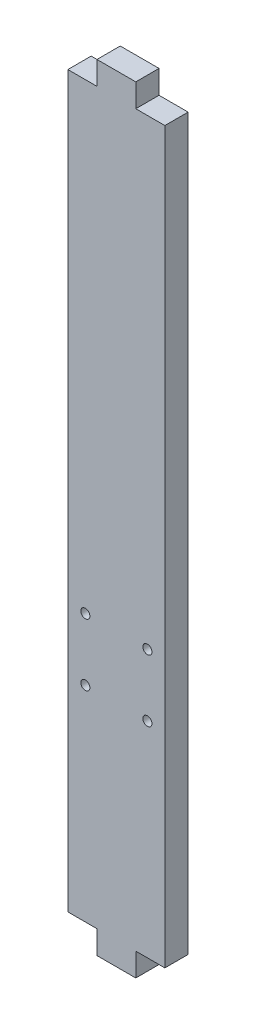
ISO-10303-21;
HEADER;
FILE_DESCRIPTION(('STEP AP214'),'2;1');
FILE_NAME('part.step','',(''),(''),'','','');
FILE_SCHEMA(('AUTOMOTIVE_DESIGN { 1 0 10303 214 1 1 1 1 }'));
ENDSEC;
DATA;
#1=APPLICATION_CONTEXT('core data for automotive mechanical design processes');
#2=APPLICATION_PROTOCOL_DEFINITION('international standard','automotive_design',2000,#1);
#3=PRODUCT_CONTEXT('',#1,'mechanical');
#4=PRODUCT('Part','Part','',(#3));
#5=PRODUCT_RELATED_PRODUCT_CATEGORY('part','',(#4));
#6=PRODUCT_DEFINITION_FORMATION('','',#4);
#7=PRODUCT_DEFINITION_CONTEXT('part definition',#1,'design');
#8=PRODUCT_DEFINITION('design','',#6,#7);
#9=PRODUCT_DEFINITION_SHAPE('','',#8);
#10=(LENGTH_UNIT() NAMED_UNIT(*) SI_UNIT(.MILLI.,.METRE.));
#11=(NAMED_UNIT(*) PLANE_ANGLE_UNIT() SI_UNIT($,.RADIAN.));
#12=(NAMED_UNIT(*) SI_UNIT($,.STERADIAN.) SOLID_ANGLE_UNIT());
#13=UNCERTAINTY_MEASURE_WITH_UNIT(LENGTH_MEASURE(1.E-05),#10,'distance_accuracy_value','');
#14=(GEOMETRIC_REPRESENTATION_CONTEXT(3) GLOBAL_UNCERTAINTY_ASSIGNED_CONTEXT((#13)) GLOBAL_UNIT_ASSIGNED_CONTEXT((#10,
#11,#12)) REPRESENTATION_CONTEXT('',''));
#15=CARTESIAN_POINT('',(0.,0.,0.));
#16=DIRECTION('',(0.,0.,1.));
#17=DIRECTION('',(1.,0.,0.));
#18=AXIS2_PLACEMENT_3D('',#15,#16,#17);
#19=CARTESIAN_POINT('',(-12.5,100.,6.));
#20=DIRECTION('',(1.,0.,0.));
#21=DIRECTION('',(0.,1.,0.));
#22=AXIS2_PLACEMENT_3D('',#19,#20,#21);
#23=PLANE('',#22);
#24=DIRECTION('',(0.,-1.,0.));
#25=VECTOR('',#24,1.);
#26=CARTESIAN_POINT('',(-12.5,100.,6.));
#27=LINE('',#26,#25);
#28=CARTESIAN_POINT('',(-12.5,94.,6.));
#29=VERTEX_POINT('',#28);
#30=CARTESIAN_POINT('',(-12.5,-94.,6.));
#31=VERTEX_POINT('',#30);
#32=EDGE_CURVE('E138',#29,#31,#27,.T.);
#33=ORIENTED_EDGE('',*,*,#32,.F.);
#34=DIRECTION('',(0.,0.,1.));
#35=VECTOR('',#34,1.);
#36=CARTESIAN_POINT('',(-12.5,94.,0.));
#37=LINE('',#36,#35);
#38=CARTESIAN_POINT('',(-12.5,94.,0.));
#39=VERTEX_POINT('',#38);
#40=EDGE_CURVE('E126',#39,#29,#37,.T.);
#41=ORIENTED_EDGE('',*,*,#40,.F.);
#42=DIRECTION('',(0.,-1.,0.));
#43=VECTOR('',#42,1.);
#44=CARTESIAN_POINT('',(-12.5,100.,0.));
#45=LINE('',#44,#43);
#46=CARTESIAN_POINT('',(-12.5,-94.,0.));
#47=VERTEX_POINT('',#46);
#48=EDGE_CURVE('E136',#39,#47,#45,.T.);
#49=ORIENTED_EDGE('',*,*,#48,.T.);
#50=DIRECTION('',(0.,0.,1.));
#51=VECTOR('',#50,1.);
#52=CARTESIAN_POINT('',(-12.5,-94.,0.));
#53=LINE('',#52,#51);
#54=EDGE_CURVE('E219',#47,#31,#53,.T.);
#55=ORIENTED_EDGE('',*,*,#54,.T.);
#56=EDGE_LOOP('',(#33,#41,#49,#55));
#57=FACE_BOUND('',#56,.T.);
#58=ADVANCED_FACE('F33',(#57),#23,.F.);
#59=CARTESIAN_POINT('',(-12.5,-100.,6.));
#60=DIRECTION('',(0.,1.,0.));
#61=DIRECTION('',(0.,0.,1.));
#62=AXIS2_PLACEMENT_3D('',#59,#60,#61);
#63=PLANE('',#62);
#64=DIRECTION('',(1.,0.,0.));
#65=VECTOR('',#64,1.);
#66=CARTESIAN_POINT('',(-12.5,-100.,0.));
#67=LINE('',#66,#65);
#68=CARTESIAN_POINT('',(-4.99999999999997,-100.,0.));
#69=VERTEX_POINT('',#68);
#70=CARTESIAN_POINT('',(5.00000000000003,-100.,0.));
#71=VERTEX_POINT('',#70);
#72=EDGE_CURVE('E144',#69,#71,#67,.T.);
#73=ORIENTED_EDGE('',*,*,#72,.T.);
#74=DIRECTION('',(0.,0.,1.));
#75=VECTOR('',#74,1.);
#76=CARTESIAN_POINT('',(5.00000000000003,-100.,0.));
#77=LINE('',#76,#75);
#78=CARTESIAN_POINT('',(5.00000000000003,-100.,6.));
#79=VERTEX_POINT('',#78);
#80=EDGE_CURVE('E204',#71,#79,#77,.T.);
#81=ORIENTED_EDGE('',*,*,#80,.T.);
#82=DIRECTION('',(1.,0.,0.));
#83=VECTOR('',#82,1.);
#84=CARTESIAN_POINT('',(-12.5,-100.,6.));
#85=LINE('',#84,#83);
#86=CARTESIAN_POINT('',(-4.99999999999997,-100.,6.));
#87=VERTEX_POINT('',#86);
#88=EDGE_CURVE('E164',#87,#79,#85,.T.);
#89=ORIENTED_EDGE('',*,*,#88,.F.);
#90=DIRECTION('',(0.,0.,1.));
#91=VECTOR('',#90,1.);
#92=CARTESIAN_POINT('',(-4.99999999999997,-100.,0.));
#93=LINE('',#92,#91);
#94=EDGE_CURVE('E215',#69,#87,#93,.T.);
#95=ORIENTED_EDGE('',*,*,#94,.F.);
#96=EDGE_LOOP('',(#73,#81,#89,#95));
#97=FACE_BOUND('',#96,.T.);
#98=ADVANCED_FACE('F267',(#97),#63,.F.);
#99=CARTESIAN_POINT('',(12.5,100.,6.));
#100=DIRECTION('',(-1.,0.,0.));
#101=DIRECTION('',(0.,0.,1.));
#102=AXIS2_PLACEMENT_3D('',#99,#100,#101);
#103=PLANE('',#102);
#104=DIRECTION('',(0.,1.,0.));
#105=VECTOR('',#104,1.);
#106=CARTESIAN_POINT('',(12.5,100.,0.));
#107=LINE('',#106,#105);
#108=CARTESIAN_POINT('',(12.5,-94.,0.));
#109=VERTEX_POINT('',#108);
#110=CARTESIAN_POINT('',(12.5,94.,0.));
#111=VERTEX_POINT('',#110);
#112=EDGE_CURVE('E148',#109,#111,#107,.T.);
#113=ORIENTED_EDGE('',*,*,#112,.T.);
#114=DIRECTION('',(0.,0.,1.));
#115=VECTOR('',#114,1.);
#116=CARTESIAN_POINT('',(12.5,94.,0.));
#117=LINE('',#116,#115);
#118=CARTESIAN_POINT('',(12.5,94.,6.));
#119=VERTEX_POINT('',#118);
#120=EDGE_CURVE('E186',#111,#119,#117,.T.);
#121=ORIENTED_EDGE('',*,*,#120,.T.);
#122=DIRECTION('',(0.,1.,0.));
#123=VECTOR('',#122,1.);
#124=CARTESIAN_POINT('',(12.5,100.,6.));
#125=LINE('',#124,#123);
#126=CARTESIAN_POINT('',(12.5,-94.,6.));
#127=VERTEX_POINT('',#126);
#128=EDGE_CURVE('E41',#127,#119,#125,.T.);
#129=ORIENTED_EDGE('',*,*,#128,.F.);
#130=DIRECTION('',(0.,0.,1.));
#131=VECTOR('',#130,1.);
#132=CARTESIAN_POINT('',(12.5,-94.,0.));
#133=LINE('',#132,#131);
#134=EDGE_CURVE('E185',#109,#127,#133,.T.);
#135=ORIENTED_EDGE('',*,*,#134,.F.);
#136=EDGE_LOOP('',(#113,#121,#129,#135));
#137=FACE_BOUND('',#136,.T.);
#138=ADVANCED_FACE('F184',(#137),#103,.F.);
#139=CARTESIAN_POINT('',(-12.5,100.,6.));
#140=DIRECTION('',(0.,-1.,0.));
#141=DIRECTION('',(0.,0.,-1.));
#142=AXIS2_PLACEMENT_3D('',#139,#140,#141);
#143=PLANE('',#142);
#144=DIRECTION('',(-1.,0.,0.));
#145=VECTOR('',#144,1.);
#146=CARTESIAN_POINT('',(-12.5,100.,0.));
#147=LINE('',#146,#145);
#148=CARTESIAN_POINT('',(5.00000000000003,100.,0.));
#149=VERTEX_POINT('',#148);
#150=CARTESIAN_POINT('',(-4.99999999999997,100.,0.));
#151=VERTEX_POINT('',#150);
#152=EDGE_CURVE('E36',#149,#151,#147,.T.);
#153=ORIENTED_EDGE('',*,*,#152,.T.);
#154=DIRECTION('',(0.,0.,1.));
#155=VECTOR('',#154,1.);
#156=CARTESIAN_POINT('',(-4.99999999999997,100.,0.));
#157=LINE('',#156,#155);
#158=CARTESIAN_POINT('',(-4.99999999999997,100.,6.));
#159=VERTEX_POINT('',#158);
#160=EDGE_CURVE('E426',#151,#159,#157,.T.);
#161=ORIENTED_EDGE('',*,*,#160,.T.);
#162=DIRECTION('',(-1.,0.,0.));
#163=VECTOR('',#162,1.);
#164=CARTESIAN_POINT('',(-12.5,100.,6.));
#165=LINE('',#164,#163);
#166=CARTESIAN_POINT('',(5.00000000000003,100.,6.));
#167=VERTEX_POINT('',#166);
#168=EDGE_CURVE('E11',#167,#159,#165,.T.);
#169=ORIENTED_EDGE('',*,*,#168,.F.);
#170=DIRECTION('',(0.,0.,1.));
#171=VECTOR('',#170,1.);
#172=CARTESIAN_POINT('',(5.00000000000003,100.,0.));
#173=LINE('',#172,#171);
#174=EDGE_CURVE('E191',#149,#167,#173,.T.);
#175=ORIENTED_EDGE('',*,*,#174,.F.);
#176=EDGE_LOOP('',(#153,#161,#169,#175));
#177=FACE_BOUND('',#176,.T.);
#178=ADVANCED_FACE('F247',(#177),#143,.F.);
#179=CARTESIAN_POINT('',(0.,0.,6.));
#180=DIRECTION('',(0.,0.,1.));
#181=DIRECTION('',(1.,0.,0.));
#182=AXIS2_PLACEMENT_3D('',#179,#180,#181);
#183=PLANE('',#182);
#184=DIRECTION('',(0.,1.,0.));
#185=VECTOR('',#184,1.);
#186=CARTESIAN_POINT('',(-4.99999999999997,100.,6.));
#187=LINE('',#186,#185);
#188=CARTESIAN_POINT('',(-4.99999999999997,94.,6.));
#189=VERTEX_POINT('',#188);
#190=EDGE_CURVE('E131',#189,#159,#187,.T.);
#191=ORIENTED_EDGE('',*,*,#190,.F.);
#192=DIRECTION('',(1.,0.,0.));
#193=VECTOR('',#192,1.);
#194=CARTESIAN_POINT('',(-12.5,94.,6.));
#195=LINE('',#194,#193);
#196=EDGE_CURVE('E427',#29,#189,#195,.T.);
#197=ORIENTED_EDGE('',*,*,#196,.F.);
#198=ORIENTED_EDGE('',*,*,#32,.T.);
#199=DIRECTION('',(-1.,0.,0.));
#200=VECTOR('',#199,1.);
#201=CARTESIAN_POINT('',(-12.5,-94.,6.));
#202=LINE('',#201,#200);
#203=CARTESIAN_POINT('',(-4.99999999999997,-94.,6.));
#204=VERTEX_POINT('',#203);
#205=EDGE_CURVE('E213',#204,#31,#202,.T.);
#206=ORIENTED_EDGE('',*,*,#205,.F.);
#207=DIRECTION('',(0.,1.,0.));
#208=VECTOR('',#207,1.);
#209=CARTESIAN_POINT('',(-4.99999999999997,-100.,6.));
#210=LINE('',#209,#208);
#211=EDGE_CURVE('E207',#87,#204,#210,.T.);
#212=ORIENTED_EDGE('',*,*,#211,.F.);
#213=ORIENTED_EDGE('',*,*,#88,.T.);
#214=DIRECTION('',(0.,-1.,0.));
#215=VECTOR('',#214,1.);
#216=CARTESIAN_POINT('',(5.00000000000003,-100.,6.));
#217=LINE('',#216,#215);
#218=CARTESIAN_POINT('',(5.00000000000003,-94.,6.));
#219=VERTEX_POINT('',#218);
#220=EDGE_CURVE('E189',#219,#79,#217,.T.);
#221=ORIENTED_EDGE('',*,*,#220,.F.);
#222=DIRECTION('',(-1.,0.,0.));
#223=VECTOR('',#222,1.);
#224=CARTESIAN_POINT('',(12.5,-94.,6.));
#225=LINE('',#224,#223);
#226=EDGE_CURVE('E183',#127,#219,#225,.T.);
#227=ORIENTED_EDGE('',*,*,#226,.F.);
#228=ORIENTED_EDGE('',*,*,#128,.T.);
#229=DIRECTION('',(1.,0.,0.));
#230=VECTOR('',#229,1.);
#231=CARTESIAN_POINT('',(12.5,94.,6.));
#232=LINE('',#231,#230);
#233=CARTESIAN_POINT('',(5.00000000000003,94.,6.));
#234=VERTEX_POINT('',#233);
#235=EDGE_CURVE('E180',#234,#119,#232,.T.);
#236=ORIENTED_EDGE('',*,*,#235,.F.);
#237=DIRECTION('',(0.,-1.,0.));
#238=VECTOR('',#237,1.);
#239=CARTESIAN_POINT('',(5.00000000000003,100.,6.));
#240=LINE('',#239,#238);
#241=EDGE_CURVE('E430',#167,#234,#240,.T.);
#242=ORIENTED_EDGE('',*,*,#241,.F.);
#243=ORIENTED_EDGE('',*,*,#168,.T.);
#244=EDGE_LOOP('',(#191,#197,#198,#206,#212,#213,#221,#227,#228,#236,#242,#243));
#245=FACE_BOUND('',#244,.T.);
#246=CARTESIAN_POINT('',(8.,-25.15,6.));
#247=DIRECTION('',(0.,0.,1.));
#248=DIRECTION('',(1.,0.,0.));
#249=AXIS2_PLACEMENT_3D('',#246,#247,#248);
#250=CIRCLE('',#249,1.17499999999999);
#251=CARTESIAN_POINT('',(9.17499999999999,-25.15,6.));
#252=VERTEX_POINT('',#251);
#253=EDGE_CURVE('E221',#252,#252,#250,.T.);
#254=ORIENTED_EDGE('',*,*,#253,.F.);
#255=EDGE_LOOP('',(#254));
#256=FACE_BOUND('',#255,.T.);
#257=CARTESIAN_POINT('',(-8.,-25.15,6.));
#258=DIRECTION('',(0.,0.,1.));
#259=DIRECTION('',(1.,0.,0.));
#260=AXIS2_PLACEMENT_3D('',#257,#258,#259);
#261=CIRCLE('',#260,1.17499999999999);
#262=CARTESIAN_POINT('',(-6.825,-25.15,6.));
#263=VERTEX_POINT('',#262);
#264=EDGE_CURVE('E228',#263,#263,#261,.T.);
#265=ORIENTED_EDGE('',*,*,#264,.F.);
#266=EDGE_LOOP('',(#265));
#267=FACE_BOUND('',#266,.T.);
#268=CARTESIAN_POINT('',(-8.,-41.15,6.));
#269=DIRECTION('',(0.,0.,1.));
#270=DIRECTION('',(1.,0.,0.));
#271=AXIS2_PLACEMENT_3D('',#268,#269,#270);
#272=CIRCLE('',#271,1.175);
#273=CARTESIAN_POINT('',(-6.825,-41.15,6.));
#274=VERTEX_POINT('',#273);
#275=EDGE_CURVE('E234',#274,#274,#272,.T.);
#276=ORIENTED_EDGE('',*,*,#275,.F.);
#277=EDGE_LOOP('',(#276));
#278=FACE_BOUND('',#277,.T.);
#279=CARTESIAN_POINT('',(8.,-41.15,6.));
#280=DIRECTION('',(0.,0.,1.));
#281=DIRECTION('',(1.,0.,0.));
#282=AXIS2_PLACEMENT_3D('',#279,#280,#281);
#283=CIRCLE('',#282,1.17499999999999);
#284=CARTESIAN_POINT('',(9.175,-41.15,6.));
#285=VERTEX_POINT('',#284);
#286=EDGE_CURVE('E151',#285,#285,#283,.T.);
#287=ORIENTED_EDGE('',*,*,#286,.F.);
#288=EDGE_LOOP('',(#287));
#289=FACE_BOUND('',#288,.T.);
#290=ADVANCED_FACE('F177',(#245,#256,#267,#278,#289),#183,.T.);
#291=CARTESIAN_POINT('',(0.,0.,0.));
#292=DIRECTION('',(0.,0.,1.));
#293=DIRECTION('',(1.,0.,0.));
#294=AXIS2_PLACEMENT_3D('',#291,#292,#293);
#295=PLANE('',#294);
#296=CARTESIAN_POINT('',(8.,-25.15,0.));
#297=DIRECTION('',(0.,0.,1.));
#298=DIRECTION('',(1.,0.,0.));
#299=AXIS2_PLACEMENT_3D('',#296,#297,#298);
#300=CIRCLE('',#299,1.17499999999999);
#301=CARTESIAN_POINT('',(9.17499999999999,-25.15,0.));
#302=VERTEX_POINT('',#301);
#303=EDGE_CURVE('E225',#302,#302,#300,.T.);
#304=ORIENTED_EDGE('',*,*,#303,.T.);
#305=EDGE_LOOP('',(#304));
#306=FACE_BOUND('',#305,.T.);
#307=CARTESIAN_POINT('',(-8.,-25.15,0.));
#308=DIRECTION('',(0.,0.,1.));
#309=DIRECTION('',(1.,0.,0.));
#310=AXIS2_PLACEMENT_3D('',#307,#308,#309);
#311=CIRCLE('',#310,1.17499999999999);
#312=CARTESIAN_POINT('',(-6.825,-25.15,0.));
#313=VERTEX_POINT('',#312);
#314=EDGE_CURVE('E231',#313,#313,#311,.T.);
#315=ORIENTED_EDGE('',*,*,#314,.T.);
#316=EDGE_LOOP('',(#315));
#317=FACE_BOUND('',#316,.T.);
#318=CARTESIAN_POINT('',(-8.,-41.15,0.));
#319=DIRECTION('',(0.,0.,1.));
#320=DIRECTION('',(1.,0.,0.));
#321=AXIS2_PLACEMENT_3D('',#318,#319,#320);
#322=CIRCLE('',#321,1.175);
#323=CARTESIAN_POINT('',(-6.825,-41.15,0.));
#324=VERTEX_POINT('',#323);
#325=EDGE_CURVE('E237',#324,#324,#322,.T.);
#326=ORIENTED_EDGE('',*,*,#325,.T.);
#327=EDGE_LOOP('',(#326));
#328=FACE_BOUND('',#327,.T.);
#329=CARTESIAN_POINT('',(8.,-41.15,0.));
#330=DIRECTION('',(0.,0.,1.));
#331=DIRECTION('',(1.,0.,0.));
#332=AXIS2_PLACEMENT_3D('',#329,#330,#331);
#333=CIRCLE('',#332,1.17499999999999);
#334=CARTESIAN_POINT('',(9.175,-41.15,0.));
#335=VERTEX_POINT('',#334);
#336=EDGE_CURVE('E145',#335,#335,#333,.T.);
#337=ORIENTED_EDGE('',*,*,#336,.T.);
#338=EDGE_LOOP('',(#337));
#339=FACE_BOUND('',#338,.T.);
#340=DIRECTION('',(1.,0.,0.));
#341=VECTOR('',#340,1.);
#342=CARTESIAN_POINT('',(-12.5,94.,0.));
#343=LINE('',#342,#341);
#344=CARTESIAN_POINT('',(-4.99999999999997,94.,0.));
#345=VERTEX_POINT('',#344);
#346=EDGE_CURVE('E122',#39,#345,#343,.T.);
#347=ORIENTED_EDGE('',*,*,#346,.T.);
#348=DIRECTION('',(0.,1.,0.));
#349=VECTOR('',#348,1.);
#350=CARTESIAN_POINT('',(-4.99999999999997,100.,0.));
#351=LINE('',#350,#349);
#352=EDGE_CURVE('E49',#345,#151,#351,.T.);
#353=ORIENTED_EDGE('',*,*,#352,.T.);
#354=ORIENTED_EDGE('',*,*,#152,.F.);
#355=DIRECTION('',(0.,-1.,0.));
#356=VECTOR('',#355,1.);
#357=CARTESIAN_POINT('',(5.00000000000003,100.,0.));
#358=LINE('',#357,#356);
#359=CARTESIAN_POINT('',(5.00000000000003,94.,0.));
#360=VERTEX_POINT('',#359);
#361=EDGE_CURVE('E433',#149,#360,#358,.T.);
#362=ORIENTED_EDGE('',*,*,#361,.T.);
#363=DIRECTION('',(1.,0.,0.));
#364=VECTOR('',#363,1.);
#365=CARTESIAN_POINT('',(12.5,94.,0.));
#366=LINE('',#365,#364);
#367=EDGE_CURVE('E57',#360,#111,#366,.T.);
#368=ORIENTED_EDGE('',*,*,#367,.T.);
#369=ORIENTED_EDGE('',*,*,#112,.F.);
#370=DIRECTION('',(-1.,0.,0.));
#371=VECTOR('',#370,1.);
#372=CARTESIAN_POINT('',(12.5,-94.,0.));
#373=LINE('',#372,#371);
#374=CARTESIAN_POINT('',(5.00000000000003,-94.,0.));
#375=VERTEX_POINT('',#374);
#376=EDGE_CURVE('E197',#109,#375,#373,.T.);
#377=ORIENTED_EDGE('',*,*,#376,.T.);
#378=DIRECTION('',(0.,-1.,0.));
#379=VECTOR('',#378,1.);
#380=CARTESIAN_POINT('',(5.00000000000003,-100.,0.));
#381=LINE('',#380,#379);
#382=EDGE_CURVE('E200',#375,#71,#381,.T.);
#383=ORIENTED_EDGE('',*,*,#382,.T.);
#384=ORIENTED_EDGE('',*,*,#72,.F.);
#385=DIRECTION('',(0.,1.,0.));
#386=VECTOR('',#385,1.);
#387=CARTESIAN_POINT('',(-4.99999999999997,-100.,0.));
#388=LINE('',#387,#386);
#389=CARTESIAN_POINT('',(-4.99999999999997,-94.,0.));
#390=VERTEX_POINT('',#389);
#391=EDGE_CURVE('E211',#69,#390,#388,.T.);
#392=ORIENTED_EDGE('',*,*,#391,.T.);
#393=DIRECTION('',(-1.,0.,0.));
#394=VECTOR('',#393,1.);
#395=CARTESIAN_POINT('',(-12.5,-94.,0.));
#396=LINE('',#395,#394);
#397=EDGE_CURVE('E143',#390,#47,#396,.T.);
#398=ORIENTED_EDGE('',*,*,#397,.T.);
#399=ORIENTED_EDGE('',*,*,#48,.F.);
#400=EDGE_LOOP('',(#347,#353,#354,#362,#368,#369,#377,#383,#384,#392,#398,#399));
#401=FACE_BOUND('',#400,.T.);
#402=ADVANCED_FACE('F141',(#306,#317,#328,#339,#401),#295,.F.);
#403=CARTESIAN_POINT('',(8.,-41.15,0.));
#404=DIRECTION('',(0.,0.,1.));
#405=DIRECTION('',(1.,0.,0.));
#406=AXIS2_PLACEMENT_3D('',#403,#404,#405);
#407=CYLINDRICAL_SURFACE('',#406,1.17499999999999);
#408=ORIENTED_EDGE('',*,*,#336,.F.);
#409=EDGE_LOOP('',(#408));
#410=FACE_BOUND('',#409,.T.);
#411=ORIENTED_EDGE('',*,*,#286,.T.);
#412=EDGE_LOOP('',(#411));
#413=FACE_BOUND('',#412,.T.);
#414=ADVANCED_FACE('F252',(#410,#413),#407,.F.);
#415=CARTESIAN_POINT('',(-8.,-41.15,0.));
#416=DIRECTION('',(0.,0.,1.));
#417=DIRECTION('',(1.,0.,0.));
#418=AXIS2_PLACEMENT_3D('',#415,#416,#417);
#419=CYLINDRICAL_SURFACE('',#418,1.175);
#420=ORIENTED_EDGE('',*,*,#325,.F.);
#421=EDGE_LOOP('',(#420));
#422=FACE_BOUND('',#421,.T.);
#423=ORIENTED_EDGE('',*,*,#275,.T.);
#424=EDGE_LOOP('',(#423));
#425=FACE_BOUND('',#424,.T.);
#426=ADVANCED_FACE('F243',(#422,#425),#419,.F.);
#427=CARTESIAN_POINT('',(-8.,-25.15,0.));
#428=DIRECTION('',(0.,0.,1.));
#429=DIRECTION('',(1.,0.,0.));
#430=AXIS2_PLACEMENT_3D('',#427,#428,#429);
#431=CYLINDRICAL_SURFACE('',#430,1.17499999999999);
#432=ORIENTED_EDGE('',*,*,#314,.F.);
#433=EDGE_LOOP('',(#432));
#434=FACE_BOUND('',#433,.T.);
#435=ORIENTED_EDGE('',*,*,#264,.T.);
#436=EDGE_LOOP('',(#435));
#437=FACE_BOUND('',#436,.T.);
#438=ADVANCED_FACE('F260',(#434,#437),#431,.F.);
#439=CARTESIAN_POINT('',(8.,-25.15,0.));
#440=DIRECTION('',(0.,0.,1.));
#441=DIRECTION('',(1.,0.,0.));
#442=AXIS2_PLACEMENT_3D('',#439,#440,#441);
#443=CYLINDRICAL_SURFACE('',#442,1.17499999999999);
#444=ORIENTED_EDGE('',*,*,#303,.F.);
#445=EDGE_LOOP('',(#444));
#446=FACE_BOUND('',#445,.T.);
#447=ORIENTED_EDGE('',*,*,#253,.T.);
#448=EDGE_LOOP('',(#447));
#449=FACE_BOUND('',#448,.T.);
#450=ADVANCED_FACE('F302',(#446,#449),#443,.F.);
#451=CARTESIAN_POINT('',(-12.5,-94.,0.));
#452=DIRECTION('',(0.,1.,0.));
#453=DIRECTION('',(0.,0.,1.));
#454=AXIS2_PLACEMENT_3D('',#451,#452,#453);
#455=PLANE('',#454);
#456=ORIENTED_EDGE('',*,*,#205,.T.);
#457=ORIENTED_EDGE('',*,*,#54,.F.);
#458=ORIENTED_EDGE('',*,*,#397,.F.);
#459=DIRECTION('',(0.,0.,1.));
#460=VECTOR('',#459,1.);
#461=CARTESIAN_POINT('',(-4.99999999999997,-94.,0.));
#462=LINE('',#461,#460);
#463=EDGE_CURVE('E222',#390,#204,#462,.T.);
#464=ORIENTED_EDGE('',*,*,#463,.T.);
#465=EDGE_LOOP('',(#456,#457,#458,#464));
#466=FACE_BOUND('',#465,.T.);
#467=ADVANCED_FACE('F296',(#466),#455,.F.);
#468=CARTESIAN_POINT('',(-4.99999999999997,-100.,0.));
#469=DIRECTION('',(1.,0.,0.));
#470=DIRECTION('',(0.,0.,-1.));
#471=AXIS2_PLACEMENT_3D('',#468,#469,#470);
#472=PLANE('',#471);
#473=ORIENTED_EDGE('',*,*,#211,.T.);
#474=ORIENTED_EDGE('',*,*,#463,.F.);
#475=ORIENTED_EDGE('',*,*,#391,.F.);
#476=ORIENTED_EDGE('',*,*,#94,.T.);
#477=EDGE_LOOP('',(#473,#474,#475,#476));
#478=FACE_BOUND('',#477,.T.);
#479=ADVANCED_FACE('F301',(#478),#472,.F.);
#480=CARTESIAN_POINT('',(5.00000000000003,-100.,0.));
#481=DIRECTION('',(-1.,0.,0.));
#482=DIRECTION('',(0.,0.,1.));
#483=AXIS2_PLACEMENT_3D('',#480,#481,#482);
#484=PLANE('',#483);
#485=ORIENTED_EDGE('',*,*,#220,.T.);
#486=ORIENTED_EDGE('',*,*,#80,.F.);
#487=ORIENTED_EDGE('',*,*,#382,.F.);
#488=DIRECTION('',(0.,0.,1.));
#489=VECTOR('',#488,1.);
#490=CARTESIAN_POINT('',(5.00000000000003,-94.,0.));
#491=LINE('',#490,#489);
#492=EDGE_CURVE('E208',#375,#219,#491,.T.);
#493=ORIENTED_EDGE('',*,*,#492,.T.);
#494=EDGE_LOOP('',(#485,#486,#487,#493));
#495=FACE_BOUND('',#494,.T.);
#496=ADVANCED_FACE('F314',(#495),#484,.F.);
#497=CARTESIAN_POINT('',(12.5,-94.,0.));
#498=DIRECTION('',(0.,1.,0.));
#499=DIRECTION('',(0.,0.,1.));
#500=AXIS2_PLACEMENT_3D('',#497,#498,#499);
#501=PLANE('',#500);
#502=ORIENTED_EDGE('',*,*,#226,.T.);
#503=ORIENTED_EDGE('',*,*,#492,.F.);
#504=ORIENTED_EDGE('',*,*,#376,.F.);
#505=ORIENTED_EDGE('',*,*,#134,.T.);
#506=EDGE_LOOP('',(#502,#503,#504,#505));
#507=FACE_BOUND('',#506,.T.);
#508=ADVANCED_FACE('F324',(#507),#501,.F.);
#509=CARTESIAN_POINT('',(12.5,94.,0.));
#510=DIRECTION('',(0.,-1.,0.));
#511=DIRECTION('',(0.,0.,-1.));
#512=AXIS2_PLACEMENT_3D('',#509,#510,#511);
#513=PLANE('',#512);
#514=ORIENTED_EDGE('',*,*,#235,.T.);
#515=ORIENTED_EDGE('',*,*,#120,.F.);
#516=ORIENTED_EDGE('',*,*,#367,.F.);
#517=DIRECTION('',(0.,0.,1.));
#518=VECTOR('',#517,1.);
#519=CARTESIAN_POINT('',(5.00000000000003,94.,0.));
#520=LINE('',#519,#518);
#521=EDGE_CURVE('E187',#360,#234,#520,.T.);
#522=ORIENTED_EDGE('',*,*,#521,.T.);
#523=EDGE_LOOP('',(#514,#515,#516,#522));
#524=FACE_BOUND('',#523,.T.);
#525=ADVANCED_FACE('F334',(#524),#513,.F.);
#526=CARTESIAN_POINT('',(5.00000000000003,100.,0.));
#527=DIRECTION('',(-1.,0.,0.));
#528=DIRECTION('',(0.,0.,1.));
#529=AXIS2_PLACEMENT_3D('',#526,#527,#528);
#530=PLANE('',#529);
#531=ORIENTED_EDGE('',*,*,#241,.T.);
#532=ORIENTED_EDGE('',*,*,#521,.F.);
#533=ORIENTED_EDGE('',*,*,#361,.F.);
#534=ORIENTED_EDGE('',*,*,#174,.T.);
#535=EDGE_LOOP('',(#531,#532,#533,#534));
#536=FACE_BOUND('',#535,.T.);
#537=ADVANCED_FACE('F344',(#536),#530,.F.);
#538=CARTESIAN_POINT('',(-4.99999999999997,100.,0.));
#539=DIRECTION('',(1.,0.,0.));
#540=DIRECTION('',(0.,0.,-1.));
#541=AXIS2_PLACEMENT_3D('',#538,#539,#540);
#542=PLANE('',#541);
#543=ORIENTED_EDGE('',*,*,#190,.T.);
#544=ORIENTED_EDGE('',*,*,#160,.F.);
#545=ORIENTED_EDGE('',*,*,#352,.F.);
#546=DIRECTION('',(0.,0.,1.));
#547=VECTOR('',#546,1.);
#548=CARTESIAN_POINT('',(-4.99999999999997,94.,0.));
#549=LINE('',#548,#547);
#550=EDGE_CURVE('E128',#345,#189,#549,.T.);
#551=ORIENTED_EDGE('',*,*,#550,.T.);
#552=EDGE_LOOP('',(#543,#544,#545,#551));
#553=FACE_BOUND('',#552,.T.);
#554=ADVANCED_FACE('F353',(#553),#542,.F.);
#555=CARTESIAN_POINT('',(-12.5,94.,0.));
#556=DIRECTION('',(0.,-1.,0.));
#557=DIRECTION('',(0.,0.,-1.));
#558=AXIS2_PLACEMENT_3D('',#555,#556,#557);
#559=PLANE('',#558);
#560=ORIENTED_EDGE('',*,*,#196,.T.);
#561=ORIENTED_EDGE('',*,*,#550,.F.);
#562=ORIENTED_EDGE('',*,*,#346,.F.);
#563=ORIENTED_EDGE('',*,*,#40,.T.);
#564=EDGE_LOOP('',(#560,#561,#562,#563));
#565=FACE_BOUND('',#564,.T.);
#566=ADVANCED_FACE('F125',(#565),#559,.F.);
#567=CLOSED_SHELL('',(#58,#98,#138,#178,#290,#402,#414,#426,#438,#450,#467,#479,#496,#508,#525,
#537,#554,#566));
#568=MANIFOLD_SOLID_BREP('B2',#567);
#569=ADVANCED_BREP_SHAPE_REPRESENTATION('',(#18,#568),#14);
#570=SHAPE_DEFINITION_REPRESENTATION(#9,#569);
ENDSEC;
END-ISO-10303-21;
